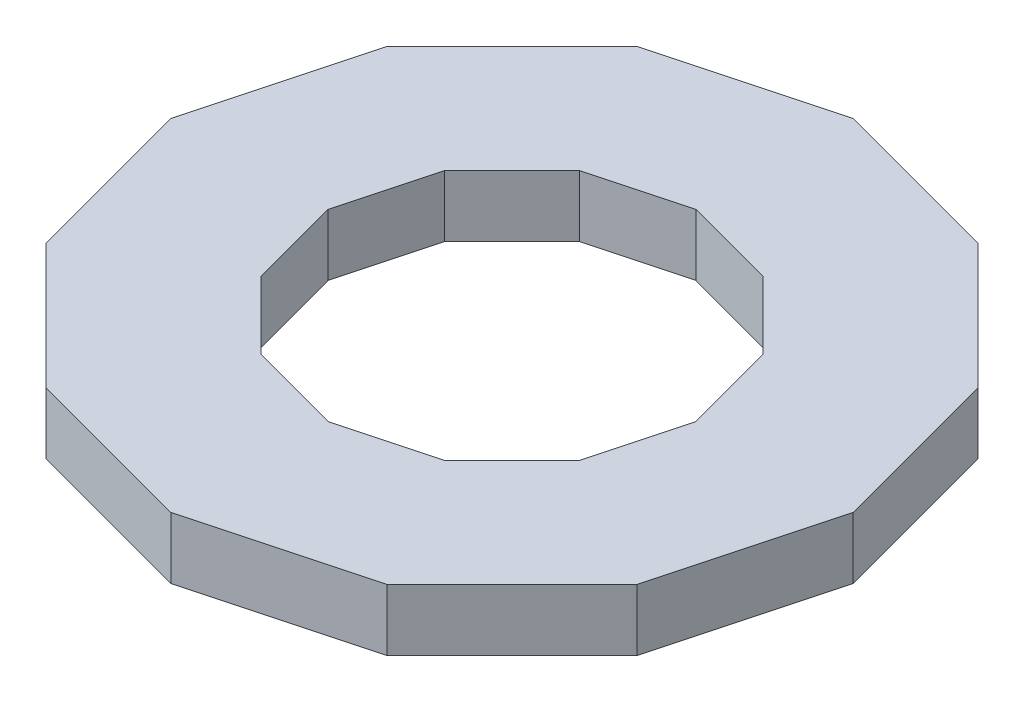
ISO-10303-21;
HEADER;
FILE_DESCRIPTION(('STEP AP214'),'2;1');
FILE_NAME('part.step','',(''),(''),'','','');
FILE_SCHEMA(('AUTOMOTIVE_DESIGN { 1 0 10303 214 1 1 1 1 }'));
ENDSEC;
DATA;
#1=APPLICATION_CONTEXT('core data for automotive mechanical design processes');
#2=APPLICATION_PROTOCOL_DEFINITION('international standard','automotive_design',2000,#1);
#3=PRODUCT_CONTEXT('',#1,'mechanical');
#4=PRODUCT('Part','Part','',(#3));
#5=PRODUCT_RELATED_PRODUCT_CATEGORY('part','',(#4));
#6=PRODUCT_DEFINITION_FORMATION('','',#4);
#7=PRODUCT_DEFINITION_CONTEXT('part definition',#1,'design');
#8=PRODUCT_DEFINITION('design','',#6,#7);
#9=PRODUCT_DEFINITION_SHAPE('','',#8);
#10=(LENGTH_UNIT() NAMED_UNIT(*) SI_UNIT(.MILLI.,.METRE.));
#11=(NAMED_UNIT(*) PLANE_ANGLE_UNIT() SI_UNIT($,.RADIAN.));
#12=(NAMED_UNIT(*) SI_UNIT($,.STERADIAN.) SOLID_ANGLE_UNIT());
#13=UNCERTAINTY_MEASURE_WITH_UNIT(LENGTH_MEASURE(1.E-05),#10,'distance_accuracy_value','');
#14=(GEOMETRIC_REPRESENTATION_CONTEXT(3) GLOBAL_UNCERTAINTY_ASSIGNED_CONTEXT((#13)) GLOBAL_UNIT_ASSIGNED_CONTEXT((#10,
#11,#12)) REPRESENTATION_CONTEXT('',''));
#15=CARTESIAN_POINT('',(0.,0.,0.));
#16=DIRECTION('',(0.,0.,1.));
#17=DIRECTION('',(1.,0.,0.));
#18=AXIS2_PLACEMENT_3D('',#15,#16,#17);
#19=CARTESIAN_POINT('',(0.,19.05,0.));
#20=DIRECTION('',(0.,1.,0.));
#21=DIRECTION('',(0.,0.,1.));
#22=AXIS2_PLACEMENT_3D('',#19,#20,#21);
#23=PLANE('',#22);
#24=DIRECTION('',(0.258819045102521,0.,-0.965925826289068));
#25=VECTOR('',#24,1.);
#26=CARTESIAN_POINT('',(91.3643106942433,19.05,52.749209373646));
#27=LINE('',#26,#25);
#28=CARTESIAN_POINT('',(91.3643106942433,19.05,52.749209373646));
#29=VERTEX_POINT('',#28);
#30=CARTESIAN_POINT('',(105.498418747292,19.05,0.));
#31=VERTEX_POINT('',#30);
#32=EDGE_CURVE('E290',#29,#31,#27,.T.);
#33=ORIENTED_EDGE('',*,*,#32,.T.);
#34=DIRECTION('',(-0.258819045102521,0.,-0.965925826289068));
#35=VECTOR('',#34,1.);
#36=CARTESIAN_POINT('',(105.498418747292,19.05,0.));
#37=LINE('',#36,#35);
#38=CARTESIAN_POINT('',(91.3643106942433,19.05,-52.749209373646));
#39=VERTEX_POINT('',#38);
#40=EDGE_CURVE('E294',#31,#39,#37,.T.);
#41=ORIENTED_EDGE('',*,*,#40,.T.);
#42=DIRECTION('',(-0.707106781186548,0.,-0.707106781186547));
#43=VECTOR('',#42,1.);
#44=CARTESIAN_POINT('',(91.3643106942433,19.05,-52.749209373646));
#45=LINE('',#44,#43);
#46=CARTESIAN_POINT('',(52.7492093736459,19.05,-91.3643106942433));
#47=VERTEX_POINT('',#46);
#48=EDGE_CURVE('E298',#39,#47,#45,.T.);
#49=ORIENTED_EDGE('',*,*,#48,.T.);
#50=DIRECTION('',(-0.965925826289068,0.,-0.25881904510252));
#51=VECTOR('',#50,1.);
#52=CARTESIAN_POINT('',(52.7492093736459,19.05,-91.3643106942433));
#53=LINE('',#52,#51);
#54=CARTESIAN_POINT('',(0.,19.05,-105.498418747292));
#55=VERTEX_POINT('',#54);
#56=EDGE_CURVE('E300',#47,#55,#53,.T.);
#57=ORIENTED_EDGE('',*,*,#56,.T.);
#58=DIRECTION('',(-0.965925826289068,0.,0.258819045102521));
#59=VECTOR('',#58,1.);
#60=CARTESIAN_POINT('',(0.,19.05,-105.498418747292));
#61=LINE('',#60,#59);
#62=CARTESIAN_POINT('',(-52.749209373646,19.05,-91.3643106942433));
#63=VERTEX_POINT('',#62);
#64=EDGE_CURVE('E302',#55,#63,#61,.T.);
#65=ORIENTED_EDGE('',*,*,#64,.T.);
#66=DIRECTION('',(-0.707106781186547,0.,0.707106781186548));
#67=VECTOR('',#66,1.);
#68=CARTESIAN_POINT('',(-52.749209373646,19.05,-91.3643106942433));
#69=LINE('',#68,#67);
#70=CARTESIAN_POINT('',(-91.3643106942433,19.05,-52.7492093736459));
#71=VERTEX_POINT('',#70);
#72=EDGE_CURVE('E304',#63,#71,#69,.T.);
#73=ORIENTED_EDGE('',*,*,#72,.T.);
#74=DIRECTION('',(-0.258819045102521,0.,0.965925826289068));
#75=VECTOR('',#74,1.);
#76=CARTESIAN_POINT('',(-91.3643106942433,19.05,-52.7492093736459));
#77=LINE('',#76,#75);
#78=CARTESIAN_POINT('',(-105.498418747292,19.05,0.));
#79=VERTEX_POINT('',#78);
#80=EDGE_CURVE('E306',#71,#79,#77,.T.);
#81=ORIENTED_EDGE('',*,*,#80,.T.);
#82=DIRECTION('',(0.258819045102521,0.,0.965925826289068));
#83=VECTOR('',#82,1.);
#84=CARTESIAN_POINT('',(-105.498418747292,19.05,0.));
#85=LINE('',#84,#83);
#86=CARTESIAN_POINT('',(-91.3643106942433,19.05,52.749209373646));
#87=VERTEX_POINT('',#86);
#88=EDGE_CURVE('E309',#79,#87,#85,.T.);
#89=ORIENTED_EDGE('',*,*,#88,.T.);
#90=DIRECTION('',(0.707106781186548,0.,0.707106781186547));
#91=VECTOR('',#90,1.);
#92=CARTESIAN_POINT('',(-91.3643106942433,19.05,52.749209373646));
#93=LINE('',#92,#91);
#94=CARTESIAN_POINT('',(-52.749209373646,19.05,91.3643106942433));
#95=VERTEX_POINT('',#94);
#96=EDGE_CURVE('E311',#87,#95,#93,.T.);
#97=ORIENTED_EDGE('',*,*,#96,.T.);
#98=DIRECTION('',(0.965925826289068,0.,0.258819045102521));
#99=VECTOR('',#98,1.);
#100=CARTESIAN_POINT('',(-52.749209373646,19.05,91.3643106942433));
#101=LINE('',#100,#99);
#102=CARTESIAN_POINT('',(0.,19.05,105.498418747292));
#103=VERTEX_POINT('',#102);
#104=EDGE_CURVE('E313',#95,#103,#101,.T.);
#105=ORIENTED_EDGE('',*,*,#104,.T.);
#106=DIRECTION('',(0.965925826289068,0.,-0.258819045102521));
#107=VECTOR('',#106,1.);
#108=CARTESIAN_POINT('',(0.,19.05,105.498418747292));
#109=LINE('',#108,#107);
#110=CARTESIAN_POINT('',(52.749209373646,19.05,91.3643106942433));
#111=VERTEX_POINT('',#110);
#112=EDGE_CURVE('E315',#103,#111,#109,.T.);
#113=ORIENTED_EDGE('',*,*,#112,.T.);
#114=DIRECTION('',(0.707106781186547,0.,-0.707106781186548));
#115=VECTOR('',#114,1.);
#116=CARTESIAN_POINT('',(52.749209373646,19.05,91.3643106942433));
#117=LINE('',#116,#115);
#118=EDGE_CURVE('E317',#111,#29,#117,.T.);
#119=ORIENTED_EDGE('',*,*,#118,.T.);
#120=EDGE_LOOP('',(#33,#41,#49,#57,#65,#73,#81,#89,#97,#105,#113,#119));
#121=FACE_BOUND('',#120,.T.);
#122=DIRECTION('',(-0.258819045102521,0.,-0.965925826289068));
#123=VECTOR('',#122,1.);
#124=CARTESIAN_POINT('',(56.8507910298221,19.05,0.));
#125=LINE('',#124,#123);
#126=CARTESIAN_POINT('',(56.8507910298221,19.05,0.));
#127=VERTEX_POINT('',#126);
#128=CARTESIAN_POINT('',(49.2342292570665,19.05,-28.4253955149111));
#129=VERTEX_POINT('',#128);
#130=EDGE_CURVE('E204',#127,#129,#125,.T.);
#131=ORIENTED_EDGE('',*,*,#130,.F.);
#132=DIRECTION('',(0.25881904510252,0.,-0.965925826289068));
#133=VECTOR('',#132,1.);
#134=CARTESIAN_POINT('',(49.2342292570665,19.05,28.425395514911));
#135=LINE('',#134,#133);
#136=CARTESIAN_POINT('',(49.2342292570665,19.05,28.425395514911));
#137=VERTEX_POINT('',#136);
#138=EDGE_CURVE('E195',#137,#127,#135,.T.);
#139=ORIENTED_EDGE('',*,*,#138,.F.);
#140=DIRECTION('',(0.707106781186547,0.,-0.707106781186548));
#141=VECTOR('',#140,1.);
#142=CARTESIAN_POINT('',(28.4253955149111,19.05,49.2342292570665));
#143=LINE('',#142,#141);
#144=CARTESIAN_POINT('',(28.4253955149111,19.05,49.2342292570665));
#145=VERTEX_POINT('',#144);
#146=EDGE_CURVE('E237',#145,#137,#143,.T.);
#147=ORIENTED_EDGE('',*,*,#146,.F.);
#148=DIRECTION('',(0.965925826289068,0.,-0.258819045102521));
#149=VECTOR('',#148,1.);
#150=CARTESIAN_POINT('',(0.,19.05,56.8507910298222));
#151=LINE('',#150,#149);
#152=CARTESIAN_POINT('',(0.,19.05,56.8507910298222));
#153=VERTEX_POINT('',#152);
#154=EDGE_CURVE('E235',#153,#145,#151,.T.);
#155=ORIENTED_EDGE('',*,*,#154,.F.);
#156=DIRECTION('',(0.965925826289068,0.,0.25881904510252));
#157=VECTOR('',#156,1.);
#158=CARTESIAN_POINT('',(-28.4253955149111,19.05,49.2342292570665));
#159=LINE('',#158,#157);
#160=CARTESIAN_POINT('',(-28.4253955149111,19.05,49.2342292570665));
#161=VERTEX_POINT('',#160);
#162=EDGE_CURVE('E233',#161,#153,#159,.T.);
#163=ORIENTED_EDGE('',*,*,#162,.F.);
#164=DIRECTION('',(0.707106781186548,0.,0.707106781186547));
#165=VECTOR('',#164,1.);
#166=CARTESIAN_POINT('',(-49.2342292570665,19.05,28.4253955149111));
#167=LINE('',#166,#165);
#168=CARTESIAN_POINT('',(-49.2342292570665,19.05,28.4253955149111));
#169=VERTEX_POINT('',#168);
#170=EDGE_CURVE('E231',#169,#161,#167,.T.);
#171=ORIENTED_EDGE('',*,*,#170,.F.);
#172=DIRECTION('',(0.258819045102521,0.,0.965925826289068));
#173=VECTOR('',#172,1.);
#174=CARTESIAN_POINT('',(-56.8507910298222,19.05,0.));
#175=LINE('',#174,#173);
#176=CARTESIAN_POINT('',(-56.8507910298222,19.05,0.));
#177=VERTEX_POINT('',#176);
#178=EDGE_CURVE('E229',#177,#169,#175,.T.);
#179=ORIENTED_EDGE('',*,*,#178,.F.);
#180=DIRECTION('',(-0.25881904510252,0.,0.965925826289068));
#181=VECTOR('',#180,1.);
#182=CARTESIAN_POINT('',(-49.2342292570665,19.05,-28.4253955149111));
#183=LINE('',#182,#181);
#184=CARTESIAN_POINT('',(-49.2342292570665,19.05,-28.4253955149111));
#185=VERTEX_POINT('',#184);
#186=EDGE_CURVE('E227',#185,#177,#183,.T.);
#187=ORIENTED_EDGE('',*,*,#186,.F.);
#188=DIRECTION('',(-0.707106781186547,0.,0.707106781186548));
#189=VECTOR('',#188,1.);
#190=CARTESIAN_POINT('',(-28.4253955149111,19.05,-49.2342292570665));
#191=LINE('',#190,#189);
#192=CARTESIAN_POINT('',(-28.4253955149111,19.05,-49.2342292570665));
#193=VERTEX_POINT('',#192);
#194=EDGE_CURVE('E225',#193,#185,#191,.T.);
#195=ORIENTED_EDGE('',*,*,#194,.F.);
#196=DIRECTION('',(-0.965925826289068,0.,0.258819045102521));
#197=VECTOR('',#196,1.);
#198=CARTESIAN_POINT('',(0.,19.05,-56.8507910298222));
#199=LINE('',#198,#197);
#200=CARTESIAN_POINT('',(0.,19.05,-56.8507910298222));
#201=VERTEX_POINT('',#200);
#202=EDGE_CURVE('E223',#201,#193,#199,.T.);
#203=ORIENTED_EDGE('',*,*,#202,.F.);
#204=DIRECTION('',(-0.965925826289069,0.,-0.25881904510252));
#205=VECTOR('',#204,1.);
#206=CARTESIAN_POINT('',(28.425395514911,19.05,-49.2342292570665));
#207=LINE('',#206,#205);
#208=CARTESIAN_POINT('',(28.425395514911,19.05,-49.2342292570665));
#209=VERTEX_POINT('',#208);
#210=EDGE_CURVE('E219',#209,#201,#207,.T.);
#211=ORIENTED_EDGE('',*,*,#210,.F.);
#212=DIRECTION('',(-0.707106781186548,0.,-0.707106781186547));
#213=VECTOR('',#212,1.);
#214=CARTESIAN_POINT('',(49.2342292570665,19.05,-28.4253955149111));
#215=LINE('',#214,#213);
#216=EDGE_CURVE('E217',#129,#209,#215,.T.);
#217=ORIENTED_EDGE('',*,*,#216,.F.);
#218=EDGE_LOOP('',(#131,#139,#147,#155,#163,#171,#179,#187,#195,#203,#211,#217));
#219=FACE_BOUND('',#218,.T.);
#220=ADVANCED_FACE('F34',(#121,#219),#23,.T.);
#221=CARTESIAN_POINT('',(0.,0.,0.));
#222=DIRECTION('',(0.,1.,0.));
#223=DIRECTION('',(0.,0.,1.));
#224=AXIS2_PLACEMENT_3D('',#221,#222,#223);
#225=PLANE('',#224);
#226=DIRECTION('',(0.258819045102521,0.,-0.965925826289068));
#227=VECTOR('',#226,1.);
#228=CARTESIAN_POINT('',(91.3643106942433,0.,52.749209373646));
#229=LINE('',#228,#227);
#230=CARTESIAN_POINT('',(91.3643106942433,0.,52.749209373646));
#231=VERTEX_POINT('',#230);
#232=CARTESIAN_POINT('',(105.498418747292,0.,0.));
#233=VERTEX_POINT('',#232);
#234=EDGE_CURVE('E212',#231,#233,#229,.T.);
#235=ORIENTED_EDGE('',*,*,#234,.F.);
#236=DIRECTION('',(0.707106781186547,0.,-0.707106781186548));
#237=VECTOR('',#236,1.);
#238=CARTESIAN_POINT('',(52.749209373646,0.,91.3643106942433));
#239=LINE('',#238,#237);
#240=CARTESIAN_POINT('',(52.749209373646,0.,91.3643106942433));
#241=VERTEX_POINT('',#240);
#242=EDGE_CURVE('E295',#241,#231,#239,.T.);
#243=ORIENTED_EDGE('',*,*,#242,.F.);
#244=DIRECTION('',(0.965925826289068,0.,-0.258819045102521));
#245=VECTOR('',#244,1.);
#246=CARTESIAN_POINT('',(0.,0.,105.498418747292));
#247=LINE('',#246,#245);
#248=CARTESIAN_POINT('',(0.,0.,105.498418747292));
#249=VERTEX_POINT('',#248);
#250=EDGE_CURVE('E341',#249,#241,#247,.T.);
#251=ORIENTED_EDGE('',*,*,#250,.F.);
#252=DIRECTION('',(0.965925826289068,0.,0.258819045102521));
#253=VECTOR('',#252,1.);
#254=CARTESIAN_POINT('',(-52.749209373646,0.,91.3643106942433));
#255=LINE('',#254,#253);
#256=CARTESIAN_POINT('',(-52.749209373646,0.,91.3643106942433));
#257=VERTEX_POINT('',#256);
#258=EDGE_CURVE('E339',#257,#249,#255,.T.);
#259=ORIENTED_EDGE('',*,*,#258,.F.);
#260=DIRECTION('',(0.707106781186548,0.,0.707106781186547));
#261=VECTOR('',#260,1.);
#262=CARTESIAN_POINT('',(-91.3643106942433,0.,52.749209373646));
#263=LINE('',#262,#261);
#264=CARTESIAN_POINT('',(-91.3643106942433,0.,52.749209373646));
#265=VERTEX_POINT('',#264);
#266=EDGE_CURVE('E337',#265,#257,#263,.T.);
#267=ORIENTED_EDGE('',*,*,#266,.F.);
#268=DIRECTION('',(0.258819045102521,0.,0.965925826289068));
#269=VECTOR('',#268,1.);
#270=CARTESIAN_POINT('',(-105.498418747292,0.,0.));
#271=LINE('',#270,#269);
#272=CARTESIAN_POINT('',(-105.498418747292,0.,0.));
#273=VERTEX_POINT('',#272);
#274=EDGE_CURVE('E335',#273,#265,#271,.T.);
#275=ORIENTED_EDGE('',*,*,#274,.F.);
#276=DIRECTION('',(-0.258819045102521,0.,0.965925826289068));
#277=VECTOR('',#276,1.);
#278=CARTESIAN_POINT('',(-91.3643106942433,0.,-52.7492093736459));
#279=LINE('',#278,#277);
#280=CARTESIAN_POINT('',(-91.3643106942433,0.,-52.7492093736459));
#281=VERTEX_POINT('',#280);
#282=EDGE_CURVE('E332',#281,#273,#279,.T.);
#283=ORIENTED_EDGE('',*,*,#282,.F.);
#284=DIRECTION('',(-0.707106781186547,0.,0.707106781186548));
#285=VECTOR('',#284,1.);
#286=CARTESIAN_POINT('',(-52.749209373646,0.,-91.3643106942433));
#287=LINE('',#286,#285);
#288=CARTESIAN_POINT('',(-52.749209373646,0.,-91.3643106942433));
#289=VERTEX_POINT('',#288);
#290=EDGE_CURVE('E330',#289,#281,#287,.T.);
#291=ORIENTED_EDGE('',*,*,#290,.F.);
#292=DIRECTION('',(-0.965925826289068,0.,0.258819045102521));
#293=VECTOR('',#292,1.);
#294=CARTESIAN_POINT('',(0.,0.,-105.498418747292));
#295=LINE('',#294,#293);
#296=CARTESIAN_POINT('',(0.,0.,-105.498418747292));
#297=VERTEX_POINT('',#296);
#298=EDGE_CURVE('E328',#297,#289,#295,.T.);
#299=ORIENTED_EDGE('',*,*,#298,.F.);
#300=DIRECTION('',(-0.965925826289068,0.,-0.25881904510252));
#301=VECTOR('',#300,1.);
#302=CARTESIAN_POINT('',(52.7492093736459,0.,-91.3643106942433));
#303=LINE('',#302,#301);
#304=CARTESIAN_POINT('',(52.7492093736459,0.,-91.3643106942433));
#305=VERTEX_POINT('',#304);
#306=EDGE_CURVE('E326',#305,#297,#303,.T.);
#307=ORIENTED_EDGE('',*,*,#306,.F.);
#308=DIRECTION('',(-0.707106781186548,0.,-0.707106781186547));
#309=VECTOR('',#308,1.);
#310=CARTESIAN_POINT('',(91.3643106942433,0.,-52.749209373646));
#311=LINE('',#310,#309);
#312=CARTESIAN_POINT('',(91.3643106942433,0.,-52.749209373646));
#313=VERTEX_POINT('',#312);
#314=EDGE_CURVE('E324',#313,#305,#311,.T.);
#315=ORIENTED_EDGE('',*,*,#314,.F.);
#316=DIRECTION('',(-0.258819045102521,0.,-0.965925826289068));
#317=VECTOR('',#316,1.);
#318=CARTESIAN_POINT('',(105.498418747292,0.,0.));
#319=LINE('',#318,#317);
#320=EDGE_CURVE('E322',#233,#313,#319,.T.);
#321=ORIENTED_EDGE('',*,*,#320,.F.);
#322=EDGE_LOOP('',(#235,#243,#251,#259,#267,#275,#283,#291,#299,#307,#315,#321));
#323=FACE_BOUND('',#322,.T.);
#324=DIRECTION('',(0.25881904510252,0.,-0.965925826289068));
#325=VECTOR('',#324,1.);
#326=CARTESIAN_POINT('',(49.2342292570665,0.,28.425395514911));
#327=LINE('',#326,#325);
#328=CARTESIAN_POINT('',(49.2342292570665,0.,28.4253955149111));
#329=VERTEX_POINT('',#328);
#330=CARTESIAN_POINT('',(56.8507910298221,0.,0.));
#331=VERTEX_POINT('',#330);
#332=EDGE_CURVE('E57',#329,#331,#327,.T.);
#333=ORIENTED_EDGE('',*,*,#332,.T.);
#334=DIRECTION('',(-0.258819045102521,0.,-0.965925826289068));
#335=VECTOR('',#334,1.);
#336=CARTESIAN_POINT('',(56.8507910298221,0.,0.));
#337=LINE('',#336,#335);
#338=CARTESIAN_POINT('',(49.2342292570665,0.,-28.4253955149111));
#339=VERTEX_POINT('',#338);
#340=EDGE_CURVE('E211',#331,#339,#337,.T.);
#341=ORIENTED_EDGE('',*,*,#340,.T.);
#342=DIRECTION('',(-0.707106781186548,0.,-0.707106781186547));
#343=VECTOR('',#342,1.);
#344=CARTESIAN_POINT('',(49.2342292570665,0.,-28.4253955149111));
#345=LINE('',#344,#343);
#346=CARTESIAN_POINT('',(28.425395514911,0.,-49.2342292570665));
#347=VERTEX_POINT('',#346);
#348=EDGE_CURVE('E242',#339,#347,#345,.T.);
#349=ORIENTED_EDGE('',*,*,#348,.T.);
#350=DIRECTION('',(-0.965925826289069,0.,-0.25881904510252));
#351=VECTOR('',#350,1.);
#352=CARTESIAN_POINT('',(28.425395514911,0.,-49.2342292570665));
#353=LINE('',#352,#351);
#354=CARTESIAN_POINT('',(0.,0.,-56.8507910298222));
#355=VERTEX_POINT('',#354);
#356=EDGE_CURVE('E245',#347,#355,#353,.T.);
#357=ORIENTED_EDGE('',*,*,#356,.T.);
#358=DIRECTION('',(-0.965925826289068,0.,0.258819045102521));
#359=VECTOR('',#358,1.);
#360=CARTESIAN_POINT('',(0.,0.,-56.8507910298222));
#361=LINE('',#360,#359);
#362=CARTESIAN_POINT('',(-28.4253955149111,0.,-49.2342292570665));
#363=VERTEX_POINT('',#362);
#364=EDGE_CURVE('E248',#355,#363,#361,.T.);
#365=ORIENTED_EDGE('',*,*,#364,.T.);
#366=DIRECTION('',(-0.707106781186547,0.,0.707106781186548));
#367=VECTOR('',#366,1.);
#368=CARTESIAN_POINT('',(-28.4253955149111,0.,-49.2342292570665));
#369=LINE('',#368,#367);
#370=CARTESIAN_POINT('',(-49.2342292570665,0.,-28.4253955149111));
#371=VERTEX_POINT('',#370);
#372=EDGE_CURVE('E251',#363,#371,#369,.T.);
#373=ORIENTED_EDGE('',*,*,#372,.T.);
#374=DIRECTION('',(-0.25881904510252,0.,0.965925826289068));
#375=VECTOR('',#374,1.);
#376=CARTESIAN_POINT('',(-49.2342292570665,0.,-28.4253955149111));
#377=LINE('',#376,#375);
#378=CARTESIAN_POINT('',(-56.8507910298222,0.,0.));
#379=VERTEX_POINT('',#378);
#380=EDGE_CURVE('E254',#371,#379,#377,.T.);
#381=ORIENTED_EDGE('',*,*,#380,.T.);
#382=DIRECTION('',(0.258819045102521,0.,0.965925826289068));
#383=VECTOR('',#382,1.);
#384=CARTESIAN_POINT('',(-56.8507910298222,0.,0.));
#385=LINE('',#384,#383);
#386=CARTESIAN_POINT('',(-49.2342292570665,0.,28.4253955149111));
#387=VERTEX_POINT('',#386);
#388=EDGE_CURVE('E257',#379,#387,#385,.T.);
#389=ORIENTED_EDGE('',*,*,#388,.T.);
#390=DIRECTION('',(0.707106781186548,0.,0.707106781186547));
#391=VECTOR('',#390,1.);
#392=CARTESIAN_POINT('',(-49.2342292570665,0.,28.4253955149111));
#393=LINE('',#392,#391);
#394=CARTESIAN_POINT('',(-28.4253955149111,0.,49.2342292570665));
#395=VERTEX_POINT('',#394);
#396=EDGE_CURVE('E260',#387,#395,#393,.T.);
#397=ORIENTED_EDGE('',*,*,#396,.T.);
#398=DIRECTION('',(0.965925826289068,0.,0.25881904510252));
#399=VECTOR('',#398,1.);
#400=CARTESIAN_POINT('',(-28.4253955149111,0.,49.2342292570665));
#401=LINE('',#400,#399);
#402=CARTESIAN_POINT('',(0.,0.,56.8507910298222));
#403=VERTEX_POINT('',#402);
#404=EDGE_CURVE('E263',#395,#403,#401,.T.);
#405=ORIENTED_EDGE('',*,*,#404,.T.);
#406=DIRECTION('',(0.965925826289068,0.,-0.258819045102521));
#407=VECTOR('',#406,1.);
#408=CARTESIAN_POINT('',(0.,0.,56.8507910298222));
#409=LINE('',#408,#407);
#410=CARTESIAN_POINT('',(28.4253955149111,0.,49.2342292570665));
#411=VERTEX_POINT('',#410);
#412=EDGE_CURVE('E266',#403,#411,#409,.T.);
#413=ORIENTED_EDGE('',*,*,#412,.T.);
#414=DIRECTION('',(0.707106781186547,0.,-0.707106781186548));
#415=VECTOR('',#414,1.);
#416=CARTESIAN_POINT('',(28.4253955149111,0.,49.2342292570665));
#417=LINE('',#416,#415);
#418=EDGE_CURVE('E205',#411,#329,#417,.T.);
#419=ORIENTED_EDGE('',*,*,#418,.T.);
#420=EDGE_LOOP('',(#333,#341,#349,#357,#365,#373,#381,#389,#397,#405,#413,#419));
#421=FACE_BOUND('',#420,.T.);
#422=ADVANCED_FACE('F384',(#323,#421),#225,.F.);
#423=CARTESIAN_POINT('',(91.3643106942433,19.05,52.749209373646));
#424=DIRECTION('',(-0.965925826289068,0.,-0.258819045102521));
#425=DIRECTION('',(-0.258819045102521,0.,0.965925826289068));
#426=AXIS2_PLACEMENT_3D('',#423,#424,#425);
#427=PLANE('',#426);
#428=ORIENTED_EDGE('',*,*,#234,.T.);
#429=DIRECTION('',(0.,-1.,0.));
#430=VECTOR('',#429,1.);
#431=CARTESIAN_POINT('',(105.498418747292,19.05,0.));
#432=LINE('',#431,#430);
#433=EDGE_CURVE('E11',#31,#233,#432,.T.);
#434=ORIENTED_EDGE('',*,*,#433,.F.);
#435=ORIENTED_EDGE('',*,*,#32,.F.);
#436=DIRECTION('',(0.,-1.,0.));
#437=VECTOR('',#436,1.);
#438=CARTESIAN_POINT('',(91.3643106942433,19.05,52.749209373646));
#439=LINE('',#438,#437);
#440=EDGE_CURVE('E319',#29,#231,#439,.T.);
#441=ORIENTED_EDGE('',*,*,#440,.T.);
#442=EDGE_LOOP('',(#428,#434,#435,#441));
#443=FACE_BOUND('',#442,.T.);
#444=ADVANCED_FACE('F36',(#443),#427,.F.);
#445=CARTESIAN_POINT('',(105.498418747292,19.05,0.));
#446=DIRECTION('',(-0.965925826289068,0.,0.258819045102521));
#447=DIRECTION('',(0.258819045102521,0.,0.965925826289068));
#448=AXIS2_PLACEMENT_3D('',#445,#446,#447);
#449=PLANE('',#448);
#450=ORIENTED_EDGE('',*,*,#320,.T.);
#451=DIRECTION('',(0.,-1.,0.));
#452=VECTOR('',#451,1.);
#453=CARTESIAN_POINT('',(91.3643106942433,19.05,-52.749209373646));
#454=LINE('',#453,#452);
#455=EDGE_CURVE('E42',#39,#313,#454,.T.);
#456=ORIENTED_EDGE('',*,*,#455,.F.);
#457=ORIENTED_EDGE('',*,*,#40,.F.);
#458=ORIENTED_EDGE('',*,*,#433,.T.);
#459=EDGE_LOOP('',(#450,#456,#457,#458));
#460=FACE_BOUND('',#459,.T.);
#461=ADVANCED_FACE('F401',(#460),#449,.F.);
#462=CARTESIAN_POINT('',(91.3643106942433,19.05,-52.749209373646));
#463=DIRECTION('',(-0.707106781186547,0.,0.707106781186548));
#464=DIRECTION('',(0.707106781186548,0.,0.707106781186547));
#465=AXIS2_PLACEMENT_3D('',#462,#463,#464);
#466=PLANE('',#465);
#467=ORIENTED_EDGE('',*,*,#314,.T.);
#468=DIRECTION('',(0.,-1.,0.));
#469=VECTOR('',#468,1.);
#470=CARTESIAN_POINT('',(52.7492093736459,19.05,-91.3643106942433));
#471=LINE('',#470,#469);
#472=EDGE_CURVE('E371',#47,#305,#471,.T.);
#473=ORIENTED_EDGE('',*,*,#472,.F.);
#474=ORIENTED_EDGE('',*,*,#48,.F.);
#475=ORIENTED_EDGE('',*,*,#455,.T.);
#476=EDGE_LOOP('',(#467,#473,#474,#475));
#477=FACE_BOUND('',#476,.T.);
#478=ADVANCED_FACE('F378',(#477),#466,.F.);
#479=CARTESIAN_POINT('',(52.7492093736459,19.05,-91.3643106942433));
#480=DIRECTION('',(-0.25881904510252,0.,0.965925826289068));
#481=DIRECTION('',(0.965925826289069,0.,0.258819045102521));
#482=AXIS2_PLACEMENT_3D('',#479,#480,#481);
#483=PLANE('',#482);
#484=ORIENTED_EDGE('',*,*,#306,.T.);
#485=DIRECTION('',(0.,-1.,0.));
#486=VECTOR('',#485,1.);
#487=CARTESIAN_POINT('',(0.,19.05,-105.498418747292));
#488=LINE('',#487,#486);
#489=EDGE_CURVE('E368',#55,#297,#488,.T.);
#490=ORIENTED_EDGE('',*,*,#489,.F.);
#491=ORIENTED_EDGE('',*,*,#56,.F.);
#492=ORIENTED_EDGE('',*,*,#472,.T.);
#493=EDGE_LOOP('',(#484,#490,#491,#492));
#494=FACE_BOUND('',#493,.T.);
#495=ADVANCED_FACE('F390',(#494),#483,.F.);
#496=CARTESIAN_POINT('',(0.,19.05,-105.498418747292));
#497=DIRECTION('',(0.258819045102521,0.,0.965925826289068));
#498=DIRECTION('',(0.965925826289068,0.,-0.258819045102521));
#499=AXIS2_PLACEMENT_3D('',#496,#497,#498);
#500=PLANE('',#499);
#501=ORIENTED_EDGE('',*,*,#298,.T.);
#502=DIRECTION('',(0.,-1.,0.));
#503=VECTOR('',#502,1.);
#504=CARTESIAN_POINT('',(-52.749209373646,19.05,-91.3643106942433));
#505=LINE('',#504,#503);
#506=EDGE_CURVE('E364',#63,#289,#505,.T.);
#507=ORIENTED_EDGE('',*,*,#506,.F.);
#508=ORIENTED_EDGE('',*,*,#64,.F.);
#509=ORIENTED_EDGE('',*,*,#489,.T.);
#510=EDGE_LOOP('',(#501,#507,#508,#509));
#511=FACE_BOUND('',#510,.T.);
#512=ADVANCED_FACE('F394',(#511),#500,.F.);
#513=CARTESIAN_POINT('',(-52.749209373646,19.05,-91.3643106942433));
#514=DIRECTION('',(0.707106781186548,0.,0.707106781186547));
#515=DIRECTION('',(0.707106781186547,0.,-0.707106781186548));
#516=AXIS2_PLACEMENT_3D('',#513,#514,#515);
#517=PLANE('',#516);
#518=ORIENTED_EDGE('',*,*,#290,.T.);
#519=DIRECTION('',(0.,-1.,0.));
#520=VECTOR('',#519,1.);
#521=CARTESIAN_POINT('',(-91.3643106942433,19.05,-52.7492093736459));
#522=LINE('',#521,#520);
#523=EDGE_CURVE('E361',#71,#281,#522,.T.);
#524=ORIENTED_EDGE('',*,*,#523,.F.);
#525=ORIENTED_EDGE('',*,*,#72,.F.);
#526=ORIENTED_EDGE('',*,*,#506,.T.);
#527=EDGE_LOOP('',(#518,#524,#525,#526));
#528=FACE_BOUND('',#527,.T.);
#529=ADVANCED_FACE('F434',(#528),#517,.F.);
#530=CARTESIAN_POINT('',(-91.3643106942433,19.05,-52.7492093736459));
#531=DIRECTION('',(0.965925826289068,0.,0.258819045102521));
#532=DIRECTION('',(0.258819045102521,0.,-0.965925826289068));
#533=AXIS2_PLACEMENT_3D('',#530,#531,#532);
#534=PLANE('',#533);
#535=ORIENTED_EDGE('',*,*,#282,.T.);
#536=DIRECTION('',(0.,-1.,0.));
#537=VECTOR('',#536,1.);
#538=CARTESIAN_POINT('',(-105.498418747292,19.05,0.));
#539=LINE('',#538,#537);
#540=EDGE_CURVE('E358',#79,#273,#539,.T.);
#541=ORIENTED_EDGE('',*,*,#540,.F.);
#542=ORIENTED_EDGE('',*,*,#80,.F.);
#543=ORIENTED_EDGE('',*,*,#523,.T.);
#544=EDGE_LOOP('',(#535,#541,#542,#543));
#545=FACE_BOUND('',#544,.T.);
#546=ADVANCED_FACE('F432',(#545),#534,.F.);
#547=CARTESIAN_POINT('',(-105.498418747292,19.05,0.));
#548=DIRECTION('',(0.965925826289068,0.,-0.258819045102521));
#549=DIRECTION('',(-0.258819045102521,0.,-0.965925826289068));
#550=AXIS2_PLACEMENT_3D('',#547,#548,#549);
#551=PLANE('',#550);
#552=ORIENTED_EDGE('',*,*,#274,.T.);
#553=DIRECTION('',(0.,-1.,0.));
#554=VECTOR('',#553,1.);
#555=CARTESIAN_POINT('',(-91.3643106942433,19.05,52.749209373646));
#556=LINE('',#555,#554);
#557=EDGE_CURVE('E355',#87,#265,#556,.T.);
#558=ORIENTED_EDGE('',*,*,#557,.F.);
#559=ORIENTED_EDGE('',*,*,#88,.F.);
#560=ORIENTED_EDGE('',*,*,#540,.T.);
#561=EDGE_LOOP('',(#552,#558,#559,#560));
#562=FACE_BOUND('',#561,.T.);
#563=ADVANCED_FACE('F428',(#562),#551,.F.);
#564=CARTESIAN_POINT('',(-91.3643106942433,19.05,52.749209373646));
#565=DIRECTION('',(0.707106781186547,0.,-0.707106781186548));
#566=DIRECTION('',(-0.707106781186548,0.,-0.707106781186547));
#567=AXIS2_PLACEMENT_3D('',#564,#565,#566);
#568=PLANE('',#567);
#569=ORIENTED_EDGE('',*,*,#266,.T.);
#570=DIRECTION('',(0.,-1.,0.));
#571=VECTOR('',#570,1.);
#572=CARTESIAN_POINT('',(-52.749209373646,19.05,91.3643106942433));
#573=LINE('',#572,#571);
#574=EDGE_CURVE('E352',#95,#257,#573,.T.);
#575=ORIENTED_EDGE('',*,*,#574,.F.);
#576=ORIENTED_EDGE('',*,*,#96,.F.);
#577=ORIENTED_EDGE('',*,*,#557,.T.);
#578=EDGE_LOOP('',(#569,#575,#576,#577));
#579=FACE_BOUND('',#578,.T.);
#580=ADVANCED_FACE('F423',(#579),#568,.F.);
#581=CARTESIAN_POINT('',(-52.749209373646,19.05,91.3643106942433));
#582=DIRECTION('',(0.258819045102521,0.,-0.965925826289068));
#583=DIRECTION('',(-0.965925826289068,0.,-0.258819045102521));
#584=AXIS2_PLACEMENT_3D('',#581,#582,#583);
#585=PLANE('',#584);
#586=ORIENTED_EDGE('',*,*,#258,.T.);
#587=DIRECTION('',(0.,-1.,0.));
#588=VECTOR('',#587,1.);
#589=CARTESIAN_POINT('',(0.,19.05,105.498418747292));
#590=LINE('',#589,#588);
#591=EDGE_CURVE('E349',#103,#249,#590,.T.);
#592=ORIENTED_EDGE('',*,*,#591,.F.);
#593=ORIENTED_EDGE('',*,*,#104,.F.);
#594=ORIENTED_EDGE('',*,*,#574,.T.);
#595=EDGE_LOOP('',(#586,#592,#593,#594));
#596=FACE_BOUND('',#595,.T.);
#597=ADVANCED_FACE('F417',(#596),#585,.F.);
#598=CARTESIAN_POINT('',(0.,19.05,105.498418747292));
#599=DIRECTION('',(-0.258819045102521,0.,-0.965925826289068));
#600=DIRECTION('',(-0.965925826289068,0.,0.258819045102521));
#601=AXIS2_PLACEMENT_3D('',#598,#599,#600);
#602=PLANE('',#601);
#603=ORIENTED_EDGE('',*,*,#250,.T.);
#604=DIRECTION('',(0.,-1.,0.));
#605=VECTOR('',#604,1.);
#606=CARTESIAN_POINT('',(52.749209373646,19.05,91.3643106942433));
#607=LINE('',#606,#605);
#608=EDGE_CURVE('E346',#111,#241,#607,.T.);
#609=ORIENTED_EDGE('',*,*,#608,.F.);
#610=ORIENTED_EDGE('',*,*,#112,.F.);
#611=ORIENTED_EDGE('',*,*,#591,.T.);
#612=EDGE_LOOP('',(#603,#609,#610,#611));
#613=FACE_BOUND('',#612,.T.);
#614=ADVANCED_FACE('F413',(#613),#602,.F.);
#615=CARTESIAN_POINT('',(52.749209373646,19.05,91.3643106942433));
#616=DIRECTION('',(-0.707106781186548,0.,-0.707106781186547));
#617=DIRECTION('',(-0.707106781186547,0.,0.707106781186548));
#618=AXIS2_PLACEMENT_3D('',#615,#616,#617);
#619=PLANE('',#618);
#620=ORIENTED_EDGE('',*,*,#242,.T.);
#621=ORIENTED_EDGE('',*,*,#440,.F.);
#622=ORIENTED_EDGE('',*,*,#118,.F.);
#623=ORIENTED_EDGE('',*,*,#608,.T.);
#624=EDGE_LOOP('',(#620,#621,#622,#623));
#625=FACE_BOUND('',#624,.T.);
#626=ADVANCED_FACE('F408',(#625),#619,.F.);
#627=CARTESIAN_POINT('',(49.2342292570665,19.05,28.425395514911));
#628=DIRECTION('',(-0.965925826289068,0.,-0.25881904510252));
#629=DIRECTION('',(-0.25881904510252,0.,0.965925826289068));
#630=AXIS2_PLACEMENT_3D('',#627,#628,#629);
#631=PLANE('',#630);
#632=ORIENTED_EDGE('',*,*,#332,.F.);
#633=DIRECTION('',(0.,-1.,0.));
#634=VECTOR('',#633,1.);
#635=CARTESIAN_POINT('',(49.2342292570665,19.05,28.425395514911));
#636=LINE('',#635,#634);
#637=EDGE_CURVE('E199',#137,#329,#636,.T.);
#638=ORIENTED_EDGE('',*,*,#637,.F.);
#639=ORIENTED_EDGE('',*,*,#138,.T.);
#640=DIRECTION('',(0.,-1.,0.));
#641=VECTOR('',#640,1.);
#642=CARTESIAN_POINT('',(56.8507910298221,19.05,0.));
#643=LINE('',#642,#641);
#644=EDGE_CURVE('E198',#127,#331,#643,.T.);
#645=ORIENTED_EDGE('',*,*,#644,.T.);
#646=EDGE_LOOP('',(#632,#638,#639,#645));
#647=FACE_BOUND('',#646,.T.);
#648=ADVANCED_FACE('F197',(#647),#631,.T.);
#649=CARTESIAN_POINT('',(56.8507910298221,19.05,0.));
#650=DIRECTION('',(-0.965925826289068,0.,0.258819045102521));
#651=DIRECTION('',(0.258819045102521,0.,0.965925826289068));
#652=AXIS2_PLACEMENT_3D('',#649,#650,#651);
#653=PLANE('',#652);
#654=ORIENTED_EDGE('',*,*,#340,.F.);
#655=ORIENTED_EDGE('',*,*,#644,.F.);
#656=ORIENTED_EDGE('',*,*,#130,.T.);
#657=DIRECTION('',(0.,-1.,0.));
#658=VECTOR('',#657,1.);
#659=CARTESIAN_POINT('',(49.2342292570665,19.05,-28.4253955149111));
#660=LINE('',#659,#658);
#661=EDGE_CURVE('E213',#129,#339,#660,.T.);
#662=ORIENTED_EDGE('',*,*,#661,.T.);
#663=EDGE_LOOP('',(#654,#655,#656,#662));
#664=FACE_BOUND('',#663,.T.);
#665=ADVANCED_FACE('F208',(#664),#653,.T.);
#666=CARTESIAN_POINT('',(49.2342292570665,19.05,-28.4253955149111));
#667=DIRECTION('',(-0.707106781186547,0.,0.707106781186548));
#668=DIRECTION('',(0.707106781186548,0.,0.707106781186547));
#669=AXIS2_PLACEMENT_3D('',#666,#667,#668);
#670=PLANE('',#669);
#671=ORIENTED_EDGE('',*,*,#348,.F.);
#672=ORIENTED_EDGE('',*,*,#661,.F.);
#673=ORIENTED_EDGE('',*,*,#216,.T.);
#674=DIRECTION('',(0.,-1.,0.));
#675=VECTOR('',#674,1.);
#676=CARTESIAN_POINT('',(28.425395514911,19.05,-49.2342292570665));
#677=LINE('',#676,#675);
#678=EDGE_CURVE('E287',#209,#347,#677,.T.);
#679=ORIENTED_EDGE('',*,*,#678,.T.);
#680=EDGE_LOOP('',(#671,#672,#673,#679));
#681=FACE_BOUND('',#680,.T.);
#682=ADVANCED_FACE('F492',(#681),#670,.T.);
#683=CARTESIAN_POINT('',(28.425395514911,19.05,-49.2342292570665));
#684=DIRECTION('',(-0.25881904510252,0.,0.965925826289068));
#685=DIRECTION('',(0.965925826289068,0.,0.25881904510252));
#686=AXIS2_PLACEMENT_3D('',#683,#684,#685);
#687=PLANE('',#686);
#688=ORIENTED_EDGE('',*,*,#356,.F.);
#689=ORIENTED_EDGE('',*,*,#678,.F.);
#690=ORIENTED_EDGE('',*,*,#210,.T.);
#691=DIRECTION('',(0.,-1.,0.));
#692=VECTOR('',#691,1.);
#693=CARTESIAN_POINT('',(0.,19.05,-56.8507910298222));
#694=LINE('',#693,#692);
#695=EDGE_CURVE('E285',#201,#355,#694,.T.);
#696=ORIENTED_EDGE('',*,*,#695,.T.);
#697=EDGE_LOOP('',(#688,#689,#690,#696));
#698=FACE_BOUND('',#697,.T.);
#699=ADVANCED_FACE('F498',(#698),#687,.T.);
#700=CARTESIAN_POINT('',(0.,19.05,-56.8507910298222));
#701=DIRECTION('',(0.258819045102521,0.,0.965925826289068));
#702=DIRECTION('',(0.965925826289068,0.,-0.258819045102521));
#703=AXIS2_PLACEMENT_3D('',#700,#701,#702);
#704=PLANE('',#703);
#705=ORIENTED_EDGE('',*,*,#364,.F.);
#706=ORIENTED_EDGE('',*,*,#695,.F.);
#707=ORIENTED_EDGE('',*,*,#202,.T.);
#708=DIRECTION('',(0.,-1.,0.));
#709=VECTOR('',#708,1.);
#710=CARTESIAN_POINT('',(-28.4253955149111,19.05,-49.2342292570665));
#711=LINE('',#710,#709);
#712=EDGE_CURVE('E283',#193,#363,#711,.T.);
#713=ORIENTED_EDGE('',*,*,#712,.T.);
#714=EDGE_LOOP('',(#705,#706,#707,#713));
#715=FACE_BOUND('',#714,.T.);
#716=ADVANCED_FACE('F506',(#715),#704,.T.);
#717=CARTESIAN_POINT('',(-28.4253955149111,19.05,-49.2342292570665));
#718=DIRECTION('',(0.707106781186548,0.,0.707106781186547));
#719=DIRECTION('',(0.707106781186547,0.,-0.707106781186548));
#720=AXIS2_PLACEMENT_3D('',#717,#718,#719);
#721=PLANE('',#720);
#722=ORIENTED_EDGE('',*,*,#372,.F.);
#723=ORIENTED_EDGE('',*,*,#712,.F.);
#724=ORIENTED_EDGE('',*,*,#194,.T.);
#725=DIRECTION('',(0.,-1.,0.));
#726=VECTOR('',#725,1.);
#727=CARTESIAN_POINT('',(-49.2342292570665,19.05,-28.4253955149111));
#728=LINE('',#727,#726);
#729=EDGE_CURVE('E281',#185,#371,#728,.T.);
#730=ORIENTED_EDGE('',*,*,#729,.T.);
#731=EDGE_LOOP('',(#722,#723,#724,#730));
#732=FACE_BOUND('',#731,.T.);
#733=ADVANCED_FACE('F514',(#732),#721,.T.);
#734=CARTESIAN_POINT('',(-49.2342292570665,19.05,-28.4253955149111));
#735=DIRECTION('',(0.965925826289068,0.,0.25881904510252));
#736=DIRECTION('',(0.25881904510252,0.,-0.965925826289069));
#737=AXIS2_PLACEMENT_3D('',#734,#735,#736);
#738=PLANE('',#737);
#739=ORIENTED_EDGE('',*,*,#380,.F.);
#740=ORIENTED_EDGE('',*,*,#729,.F.);
#741=ORIENTED_EDGE('',*,*,#186,.T.);
#742=DIRECTION('',(0.,-1.,0.));
#743=VECTOR('',#742,1.);
#744=CARTESIAN_POINT('',(-56.8507910298222,19.05,0.));
#745=LINE('',#744,#743);
#746=EDGE_CURVE('E279',#177,#379,#745,.T.);
#747=ORIENTED_EDGE('',*,*,#746,.T.);
#748=EDGE_LOOP('',(#739,#740,#741,#747));
#749=FACE_BOUND('',#748,.T.);
#750=ADVANCED_FACE('F522',(#749),#738,.T.);
#751=CARTESIAN_POINT('',(-56.8507910298222,19.05,0.));
#752=DIRECTION('',(0.965925826289068,0.,-0.258819045102521));
#753=DIRECTION('',(-0.258819045102521,0.,-0.965925826289068));
#754=AXIS2_PLACEMENT_3D('',#751,#752,#753);
#755=PLANE('',#754);
#756=ORIENTED_EDGE('',*,*,#388,.F.);
#757=ORIENTED_EDGE('',*,*,#746,.F.);
#758=ORIENTED_EDGE('',*,*,#178,.T.);
#759=DIRECTION('',(0.,-1.,0.));
#760=VECTOR('',#759,1.);
#761=CARTESIAN_POINT('',(-49.2342292570665,19.05,28.4253955149111));
#762=LINE('',#761,#760);
#763=EDGE_CURVE('E277',#169,#387,#762,.T.);
#764=ORIENTED_EDGE('',*,*,#763,.T.);
#765=EDGE_LOOP('',(#756,#757,#758,#764));
#766=FACE_BOUND('',#765,.T.);
#767=ADVANCED_FACE('F530',(#766),#755,.T.);
#768=CARTESIAN_POINT('',(-49.2342292570665,19.05,28.4253955149111));
#769=DIRECTION('',(0.707106781186547,0.,-0.707106781186548));
#770=DIRECTION('',(-0.707106781186548,0.,-0.707106781186547));
#771=AXIS2_PLACEMENT_3D('',#768,#769,#770);
#772=PLANE('',#771);
#773=ORIENTED_EDGE('',*,*,#396,.F.);
#774=ORIENTED_EDGE('',*,*,#763,.F.);
#775=ORIENTED_EDGE('',*,*,#170,.T.);
#776=DIRECTION('',(0.,-1.,0.));
#777=VECTOR('',#776,1.);
#778=CARTESIAN_POINT('',(-28.4253955149111,19.05,49.2342292570665));
#779=LINE('',#778,#777);
#780=EDGE_CURVE('E275',#161,#395,#779,.T.);
#781=ORIENTED_EDGE('',*,*,#780,.T.);
#782=EDGE_LOOP('',(#773,#774,#775,#781));
#783=FACE_BOUND('',#782,.T.);
#784=ADVANCED_FACE('F538',(#783),#772,.T.);
#785=CARTESIAN_POINT('',(-28.4253955149111,19.05,49.2342292570665));
#786=DIRECTION('',(0.25881904510252,0.,-0.965925826289068));
#787=DIRECTION('',(-0.965925826289068,0.,-0.25881904510252));
#788=AXIS2_PLACEMENT_3D('',#785,#786,#787);
#789=PLANE('',#788);
#790=ORIENTED_EDGE('',*,*,#404,.F.);
#791=ORIENTED_EDGE('',*,*,#780,.F.);
#792=ORIENTED_EDGE('',*,*,#162,.T.);
#793=DIRECTION('',(0.,-1.,0.));
#794=VECTOR('',#793,1.);
#795=CARTESIAN_POINT('',(0.,19.05,56.8507910298222));
#796=LINE('',#795,#794);
#797=EDGE_CURVE('E273',#153,#403,#796,.T.);
#798=ORIENTED_EDGE('',*,*,#797,.T.);
#799=EDGE_LOOP('',(#790,#791,#792,#798));
#800=FACE_BOUND('',#799,.T.);
#801=ADVANCED_FACE('F546',(#800),#789,.T.);
#802=CARTESIAN_POINT('',(0.,19.05,56.8507910298222));
#803=DIRECTION('',(-0.258819045102521,0.,-0.965925826289068));
#804=DIRECTION('',(-0.965925826289068,0.,0.258819045102521));
#805=AXIS2_PLACEMENT_3D('',#802,#803,#804);
#806=PLANE('',#805);
#807=ORIENTED_EDGE('',*,*,#412,.F.);
#808=ORIENTED_EDGE('',*,*,#797,.F.);
#809=ORIENTED_EDGE('',*,*,#154,.T.);
#810=DIRECTION('',(0.,-1.,0.));
#811=VECTOR('',#810,1.);
#812=CARTESIAN_POINT('',(28.4253955149111,19.05,49.2342292570665));
#813=LINE('',#812,#811);
#814=EDGE_CURVE('E49',#145,#411,#813,.T.);
#815=ORIENTED_EDGE('',*,*,#814,.T.);
#816=EDGE_LOOP('',(#807,#808,#809,#815));
#817=FACE_BOUND('',#816,.T.);
#818=ADVANCED_FACE('F554',(#817),#806,.T.);
#819=CARTESIAN_POINT('',(28.4253955149111,19.05,49.2342292570665));
#820=DIRECTION('',(-0.707106781186548,0.,-0.707106781186547));
#821=DIRECTION('',(-0.707106781186547,0.,0.707106781186548));
#822=AXIS2_PLACEMENT_3D('',#819,#820,#821);
#823=PLANE('',#822);
#824=ORIENTED_EDGE('',*,*,#418,.F.);
#825=ORIENTED_EDGE('',*,*,#814,.F.);
#826=ORIENTED_EDGE('',*,*,#146,.T.);
#827=ORIENTED_EDGE('',*,*,#637,.T.);
#828=EDGE_LOOP('',(#824,#825,#826,#827));
#829=FACE_BOUND('',#828,.T.);
#830=ADVANCED_FACE('F562',(#829),#823,.T.);
#831=CLOSED_SHELL('',(#220,#422,#444,#461,#478,#495,#512,#529,#546,#563,#580,#597,#614,#626,
#648,#665,#682,#699,#716,#733,#750,#767,#784,#801,#818,#830));
#832=MANIFOLD_SOLID_BREP('B2',#831);
#833=ADVANCED_BREP_SHAPE_REPRESENTATION('',(#18,#832),#14);
#834=SHAPE_DEFINITION_REPRESENTATION(#9,#833);
ENDSEC;
END-ISO-10303-21;
